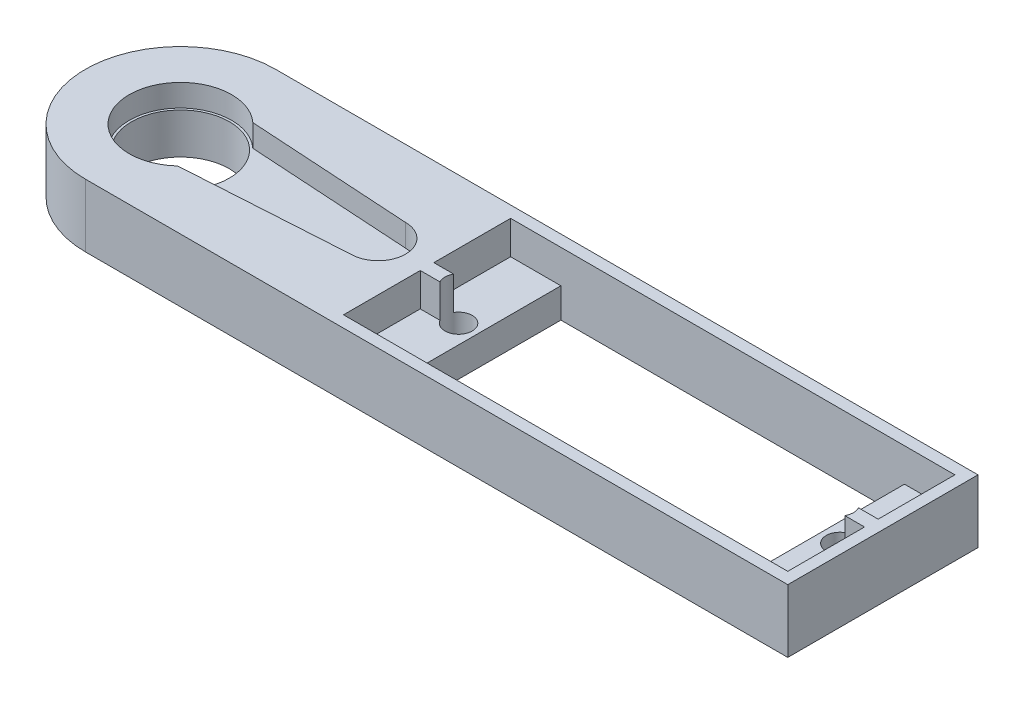
ISO-10303-21;
HEADER;
FILE_DESCRIPTION(('STEP AP214'),'2;1');
FILE_NAME('part.step','',(''),(''),'','','');
FILE_SCHEMA(('AUTOMOTIVE_DESIGN { 1 0 10303 214 1 1 1 1 }'));
ENDSEC;
DATA;
#1=APPLICATION_CONTEXT('core data for automotive mechanical design processes');
#2=APPLICATION_PROTOCOL_DEFINITION('international standard','automotive_design',2000,#1);
#3=PRODUCT_CONTEXT('',#1,'mechanical');
#4=PRODUCT('Part','Part','',(#3));
#5=PRODUCT_RELATED_PRODUCT_CATEGORY('part','',(#4));
#6=PRODUCT_DEFINITION_FORMATION('','',#4);
#7=PRODUCT_DEFINITION_CONTEXT('part definition',#1,'design');
#8=PRODUCT_DEFINITION('design','',#6,#7);
#9=PRODUCT_DEFINITION_SHAPE('','',#8);
#10=(LENGTH_UNIT() NAMED_UNIT(*) SI_UNIT(.MILLI.,.METRE.));
#11=(NAMED_UNIT(*) PLANE_ANGLE_UNIT() SI_UNIT($,.RADIAN.));
#12=(NAMED_UNIT(*) SI_UNIT($,.STERADIAN.) SOLID_ANGLE_UNIT());
#13=UNCERTAINTY_MEASURE_WITH_UNIT(LENGTH_MEASURE(1.E-05),#10,'distance_accuracy_value','');
#14=(GEOMETRIC_REPRESENTATION_CONTEXT(3) GLOBAL_UNCERTAINTY_ASSIGNED_CONTEXT((#13)) GLOBAL_UNIT_ASSIGNED_CONTEXT((#10,
#11,#12)) REPRESENTATION_CONTEXT('',''));
#15=CARTESIAN_POINT('',(0.,0.,0.));
#16=DIRECTION('',(0.,0.,1.));
#17=DIRECTION('',(1.,0.,0.));
#18=AXIS2_PLACEMENT_3D('',#15,#16,#17);
#19=CARTESIAN_POINT('',(33.15,-0.00100000000000013,-7.));
#20=DIRECTION('',(-1.,0.,0.));
#21=DIRECTION('',(0.,0.,1.));
#22=AXIS2_PLACEMENT_3D('',#19,#20,#21);
#23=PLANE('',#22);
#24=DIRECTION('',(0.,1.,0.));
#25=VECTOR('',#24,1.);
#26=CARTESIAN_POINT('',(33.15,-4.15931969640728,-0.5));
#27=LINE('',#26,#25);
#28=CARTESIAN_POINT('',(33.15,2.19,-0.5));
#29=VERTEX_POINT('',#28);
#30=CARTESIAN_POINT('',(33.15,4.64,-0.500000000000001));
#31=VERTEX_POINT('',#30);
#32=EDGE_CURVE('E479',#29,#31,#27,.T.);
#33=ORIENTED_EDGE('',*,*,#32,.F.);
#34=DIRECTION('',(0.,0.,1.));
#35=VECTOR('',#34,1.);
#36=CARTESIAN_POINT('',(33.15,2.19,-6.15));
#37=LINE('',#36,#35);
#38=CARTESIAN_POINT('',(33.15,2.19,-6.15));
#39=VERTEX_POINT('',#38);
#40=EDGE_CURVE('E502',#39,#29,#37,.T.);
#41=ORIENTED_EDGE('',*,*,#40,.F.);
#42=DIRECTION('',(0.,1.,0.));
#43=VECTOR('',#42,1.);
#44=CARTESIAN_POINT('',(33.15,-4.15931969640728,-6.15));
#45=LINE('',#44,#43);
#46=CARTESIAN_POINT('',(33.15,4.64,-6.15));
#47=VERTEX_POINT('',#46);
#48=EDGE_CURVE('E227',#39,#47,#45,.T.);
#49=ORIENTED_EDGE('',*,*,#48,.T.);
#50=DIRECTION('',(0.,0.,1.));
#51=VECTOR('',#50,1.);
#52=CARTESIAN_POINT('',(33.15,4.64,-7.));
#53=LINE('',#52,#51);
#54=EDGE_CURVE('E11',#47,#31,#53,.T.);
#55=ORIENTED_EDGE('',*,*,#54,.T.);
#56=EDGE_LOOP('',(#33,#41,#49,#55));
#57=FACE_BOUND('',#56,.T.);
#58=ADVANCED_FACE('F41',(#57),#23,.F.);
#59=DIRECTION('',(0.,1.,0.));
#60=VECTOR('',#59,1.);
#61=CARTESIAN_POINT('',(33.15,-4.15931969640728,6.15));
#62=LINE('',#61,#60);
#63=CARTESIAN_POINT('',(33.15,2.19,6.15));
#64=VERTEX_POINT('',#63);
#65=CARTESIAN_POINT('',(33.15,4.64,6.15));
#66=VERTEX_POINT('',#65);
#67=EDGE_CURVE('E219',#64,#66,#62,.T.);
#68=ORIENTED_EDGE('',*,*,#67,.F.);
#69=DIRECTION('',(0.,0.,1.));
#70=VECTOR('',#69,1.);
#71=CARTESIAN_POINT('',(33.15,2.19,0.5));
#72=LINE('',#71,#70);
#73=CARTESIAN_POINT('',(33.15,2.19,0.5));
#74=VERTEX_POINT('',#73);
#75=EDGE_CURVE('E455',#74,#64,#72,.T.);
#76=ORIENTED_EDGE('',*,*,#75,.F.);
#77=DIRECTION('',(0.,1.,0.));
#78=VECTOR('',#77,1.);
#79=CARTESIAN_POINT('',(33.15,-4.15931969640728,0.5));
#80=LINE('',#79,#78);
#81=CARTESIAN_POINT('',(33.15,4.64,0.5));
#82=VERTEX_POINT('',#81);
#83=EDGE_CURVE('E226',#74,#82,#80,.T.);
#84=ORIENTED_EDGE('',*,*,#83,.T.);
#85=EDGE_CURVE('E50',#82,#66,#53,.T.);
#86=ORIENTED_EDGE('',*,*,#85,.T.);
#87=EDGE_LOOP('',(#68,#76,#84,#86));
#88=FACE_BOUND('',#87,.T.);
#89=ADVANCED_FACE('F229',(#88),#23,.F.);
#90=CARTESIAN_POINT('',(15.,4.64,0.));
#91=DIRECTION('',(0.,1.,0.));
#92=DIRECTION('',(0.,0.,1.));
#93=AXIS2_PLACEMENT_3D('',#90,#91,#92);
#94=PLANE('',#93);
#95=DIRECTION('',(0.,0.,-1.));
#96=VECTOR('',#95,1.);
#97=CARTESIAN_POINT('',(66.7,4.64,0.));
#98=LINE('',#97,#96);
#99=CARTESIAN_POINT('',(66.7,4.64,7.));
#100=VERTEX_POINT('',#99);
#101=CARTESIAN_POINT('',(66.7,4.64,-7.));
#102=VERTEX_POINT('',#101);
#103=EDGE_CURVE('E272',#100,#102,#98,.T.);
#104=ORIENTED_EDGE('',*,*,#103,.T.);
#105=DIRECTION('',(-1.,0.,0.));
#106=VECTOR('',#105,1.);
#107=CARTESIAN_POINT('',(70.,4.64,-7.));
#108=LINE('',#107,#106);
#109=CARTESIAN_POINT('',(15.,4.64,-7.));
#110=VERTEX_POINT('',#109);
#111=EDGE_CURVE('E239',#102,#110,#108,.T.);
#112=ORIENTED_EDGE('',*,*,#111,.T.);
#113=CARTESIAN_POINT('',(15.,4.64,0.));
#114=DIRECTION('',(0.,1.,0.));
#115=DIRECTION('',(0.,0.,1.));
#116=AXIS2_PLACEMENT_3D('',#113,#114,#115);
#117=CIRCLE('',#116,7.);
#118=CARTESIAN_POINT('',(15.,4.64,7.));
#119=VERTEX_POINT('',#118);
#120=EDGE_CURVE('E238',#110,#119,#117,.T.);
#121=ORIENTED_EDGE('',*,*,#120,.T.);
#122=DIRECTION('',(1.,0.,0.));
#123=VECTOR('',#122,1.);
#124=CARTESIAN_POINT('',(15.,4.64,7.));
#125=LINE('',#124,#123);
#126=EDGE_CURVE('E236',#119,#100,#125,.T.);
#127=ORIENTED_EDGE('',*,*,#126,.T.);
#128=EDGE_LOOP('',(#104,#112,#121,#127));
#129=FACE_BOUND('',#128,.T.);
#130=ORIENTED_EDGE('',*,*,#54,.F.);
#131=DIRECTION('',(1.,0.,0.));
#132=VECTOR('',#131,1.);
#133=CARTESIAN_POINT('',(37.85,4.64,-6.15));
#134=LINE('',#133,#132);
#135=CARTESIAN_POINT('',(65.85,4.64,-6.15));
#136=VERTEX_POINT('',#135);
#137=EDGE_CURVE('E216',#47,#136,#134,.T.);
#138=ORIENTED_EDGE('',*,*,#137,.T.);
#139=DIRECTION('',(0.,0.,-1.));
#140=VECTOR('',#139,1.);
#141=CARTESIAN_POINT('',(65.85,4.64,-6.15));
#142=LINE('',#141,#140);
#143=CARTESIAN_POINT('',(65.85,4.64,-0.5));
#144=VERTEX_POINT('',#143);
#145=EDGE_CURVE('E468',#144,#136,#142,.T.);
#146=ORIENTED_EDGE('',*,*,#145,.F.);
#147=DIRECTION('',(-1.,0.,0.));
#148=VECTOR('',#147,1.);
#149=CARTESIAN_POINT('',(0.,4.64,-0.499999999999984));
#150=LINE('',#149,#148);
#151=CARTESIAN_POINT('',(64.3943800341658,4.64,-0.5));
#152=VERTEX_POINT('',#151);
#153=EDGE_CURVE('E327',#144,#152,#150,.T.);
#154=ORIENTED_EDGE('',*,*,#153,.T.);
#155=CARTESIAN_POINT('',(63.5283546303813,4.64,0.));
#156=DIRECTION('',(0.,1.,0.));
#157=DIRECTION('',(0.,0.,1.));
#158=AXIS2_PLACEMENT_3D('',#155,#156,#157);
#159=CIRCLE('',#158,1.00000000000001);
#160=CARTESIAN_POINT('',(64.3943800341658,4.64,0.5));
#161=VERTEX_POINT('',#160);
#162=EDGE_CURVE('E339',#161,#152,#159,.T.);
#163=ORIENTED_EDGE('',*,*,#162,.F.);
#164=DIRECTION('',(1.,0.,0.));
#165=VECTOR('',#164,1.);
#166=CARTESIAN_POINT('',(0.,4.64,0.499999999999984));
#167=LINE('',#166,#165);
#168=CARTESIAN_POINT('',(65.85,4.64,0.5));
#169=VERTEX_POINT('',#168);
#170=EDGE_CURVE('E321',#161,#169,#167,.T.);
#171=ORIENTED_EDGE('',*,*,#170,.T.);
#172=DIRECTION('',(0.,0.,-1.));
#173=VECTOR('',#172,1.);
#174=CARTESIAN_POINT('',(65.85,4.64,6.15));
#175=LINE('',#174,#173);
#176=CARTESIAN_POINT('',(65.85,4.64,6.15));
#177=VERTEX_POINT('',#176);
#178=EDGE_CURVE('E212',#177,#169,#175,.T.);
#179=ORIENTED_EDGE('',*,*,#178,.F.);
#180=DIRECTION('',(-1.,0.,0.));
#181=VECTOR('',#180,1.);
#182=CARTESIAN_POINT('',(37.85,4.64,6.15));
#183=LINE('',#182,#181);
#184=EDGE_CURVE('E206',#177,#66,#183,.T.);
#185=ORIENTED_EDGE('',*,*,#184,.T.);
#186=ORIENTED_EDGE('',*,*,#85,.F.);
#187=DIRECTION('',(-1.,0.,0.));
#188=VECTOR('',#187,1.);
#189=CARTESIAN_POINT('',(0.,4.64,0.500000000000009));
#190=LINE('',#189,#188);
#191=CARTESIAN_POINT('',(34.6056199658342,4.64,0.5));
#192=VERTEX_POINT('',#191);
#193=EDGE_CURVE('E58',#192,#82,#190,.T.);
#194=ORIENTED_EDGE('',*,*,#193,.F.);
#195=CARTESIAN_POINT('',(35.4716453696186,4.64,0.));
#196=DIRECTION('',(0.,1.,0.));
#197=DIRECTION('',(0.,0.,1.));
#198=AXIS2_PLACEMENT_3D('',#195,#196,#197);
#199=CIRCLE('',#198,1.00000000000001);
#200=CARTESIAN_POINT('',(34.6056199658342,4.64,-0.5));
#201=VERTEX_POINT('',#200);
#202=EDGE_CURVE('E347',#201,#192,#199,.T.);
#203=ORIENTED_EDGE('',*,*,#202,.F.);
#204=DIRECTION('',(-1.,0.,0.));
#205=VECTOR('',#204,1.);
#206=CARTESIAN_POINT('',(0.,4.64,-0.500000000000008));
#207=LINE('',#206,#205);
#208=EDGE_CURVE('E268',#201,#31,#207,.T.);
#209=ORIENTED_EDGE('',*,*,#208,.T.);
#210=EDGE_LOOP('',(#130,#138,#146,#154,#163,#171,#179,#185,#186,#194,#203,#209));
#211=FACE_BOUND('',#210,.T.);
#212=DIRECTION('',(-0.998071858143405,0.,-0.0620690420593882));
#213=VECTOR('',#212,1.);
#214=CARTESIAN_POINT('',(29.5553968890811,4.64,-2.01999279047927));
#215=LINE('',#214,#213);
#216=CARTESIAN_POINT('',(29.5553968890811,4.64,-2.01999279047927));
#217=VERTEX_POINT('',#216);
#218=CARTESIAN_POINT('',(17.5618184422242,4.64,-2.76586085497446));
#219=VERTEX_POINT('',#218);
#220=EDGE_CURVE('E287',#217,#219,#215,.T.);
#221=ORIENTED_EDGE('',*,*,#220,.F.);
#222=CARTESIAN_POINT('',(29.55,4.64,0.));
#223=DIRECTION('',(0.,1.,0.));
#224=DIRECTION('',(0.,0.,1.));
#225=AXIS2_PLACEMENT_3D('',#222,#223,#224);
#226=CIRCLE('',#225,2.02);
#227=CARTESIAN_POINT('',(29.5553968890812,4.64,2.01999279047927));
#228=VERTEX_POINT('',#227);
#229=EDGE_CURVE('E283',#228,#217,#226,.T.);
#230=ORIENTED_EDGE('',*,*,#229,.F.);
#231=DIRECTION('',(0.998071858143405,0.,-0.0620690420593882));
#232=VECTOR('',#231,1.);
#233=CARTESIAN_POINT('',(17.5618184422242,4.64,2.76586085497446));
#234=LINE('',#233,#232);
#235=CARTESIAN_POINT('',(17.5618184422242,4.64,2.76586085497446));
#236=VERTEX_POINT('',#235);
#237=EDGE_CURVE('E230',#236,#228,#234,.T.);
#238=ORIENTED_EDGE('',*,*,#237,.F.);
#239=CARTESIAN_POINT('',(15.,4.64,0.));
#240=DIRECTION('',(0.,1.,0.));
#241=DIRECTION('',(0.,0.,-1.));
#242=AXIS2_PLACEMENT_3D('',#239,#240,#241);
#243=CIRCLE('',#242,3.77);
#244=EDGE_CURVE('E290',#219,#236,#243,.T.);
#245=ORIENTED_EDGE('',*,*,#244,.F.);
#246=EDGE_LOOP('',(#221,#230,#238,#245));
#247=FACE_BOUND('',#246,.T.);
#248=ADVANCED_FACE('F43',(#129,#211,#247),#94,.T.);
#249=CARTESIAN_POINT('',(15.,3.,7.));
#250=DIRECTION('',(0.,0.,-1.));
#251=DIRECTION('',(-1.,0.,0.));
#252=AXIS2_PLACEMENT_3D('',#249,#250,#251);
#253=PLANE('',#252);
#254=DIRECTION('',(1.,0.,0.));
#255=VECTOR('',#254,1.);
#256=CARTESIAN_POINT('',(15.,0.,7.));
#257=LINE('',#256,#255);
#258=CARTESIAN_POINT('',(15.,0.,7.));
#259=VERTEX_POINT('',#258);
#260=CARTESIAN_POINT('',(66.7,0.,7.));
#261=VERTEX_POINT('',#260);
#262=EDGE_CURVE('E45',#259,#261,#257,.T.);
#263=ORIENTED_EDGE('',*,*,#262,.T.);
#264=DIRECTION('',(0.,1.,0.));
#265=VECTOR('',#264,1.);
#266=CARTESIAN_POINT('',(66.7,-36.2154663092994,7.));
#267=LINE('',#266,#265);
#268=EDGE_CURVE('E258',#261,#100,#267,.T.);
#269=ORIENTED_EDGE('',*,*,#268,.T.);
#270=ORIENTED_EDGE('',*,*,#126,.F.);
#271=DIRECTION('',(0.,-1.,0.));
#272=VECTOR('',#271,1.);
#273=CARTESIAN_POINT('',(15.,3.,7.));
#274=LINE('',#273,#272);
#275=EDGE_CURVE('E234',#119,#259,#274,.T.);
#276=ORIENTED_EDGE('',*,*,#275,.T.);
#277=EDGE_LOOP('',(#263,#269,#270,#276));
#278=FACE_BOUND('',#277,.T.);
#279=ADVANCED_FACE('F256',(#278),#253,.F.);
#280=CARTESIAN_POINT('',(15.,3.,-7.));
#281=DIRECTION('',(0.,0.,1.));
#282=DIRECTION('',(1.,0.,0.));
#283=AXIS2_PLACEMENT_3D('',#280,#281,#282);
#284=PLANE('',#283);
#285=ORIENTED_EDGE('',*,*,#111,.F.);
#286=DIRECTION('',(0.,1.,0.));
#287=VECTOR('',#286,1.);
#288=CARTESIAN_POINT('',(66.7,-36.2154663092994,-7.));
#289=LINE('',#288,#287);
#290=CARTESIAN_POINT('',(66.7,0.,-7.));
#291=VERTEX_POINT('',#290);
#292=EDGE_CURVE('E273',#291,#102,#289,.T.);
#293=ORIENTED_EDGE('',*,*,#292,.F.);
#294=DIRECTION('',(-1.,0.,0.));
#295=VECTOR('',#294,1.);
#296=CARTESIAN_POINT('',(15.,0.,-7.));
#297=LINE('',#296,#295);
#298=CARTESIAN_POINT('',(15.,0.,-7.));
#299=VERTEX_POINT('',#298);
#300=EDGE_CURVE('E241',#291,#299,#297,.T.);
#301=ORIENTED_EDGE('',*,*,#300,.T.);
#302=DIRECTION('',(0.,-1.,0.));
#303=VECTOR('',#302,1.);
#304=CARTESIAN_POINT('',(15.,3.,-7.));
#305=LINE('',#304,#303);
#306=EDGE_CURVE('E315',#110,#299,#305,.T.);
#307=ORIENTED_EDGE('',*,*,#306,.F.);
#308=EDGE_LOOP('',(#285,#293,#301,#307));
#309=FACE_BOUND('',#308,.T.);
#310=ADVANCED_FACE('F319',(#309),#284,.F.);
#311=CARTESIAN_POINT('',(15.,0.,0.));
#312=DIRECTION('',(0.,1.,0.));
#313=DIRECTION('',(0.,0.,1.));
#314=AXIS2_PLACEMENT_3D('',#311,#312,#313);
#315=PLANE('',#314);
#316=CARTESIAN_POINT('',(15.,0.,0.));
#317=DIRECTION('',(0.,-1.,0.));
#318=DIRECTION('',(0.,0.,-1.));
#319=AXIS2_PLACEMENT_3D('',#316,#317,#318);
#320=CIRCLE('',#319,3.6);
#321=CARTESIAN_POINT('',(15.,0.,-3.6));
#322=VERTEX_POINT('',#321);
#323=EDGE_CURVE('E286',#322,#322,#320,.T.);
#324=ORIENTED_EDGE('',*,*,#323,.F.);
#325=EDGE_LOOP('',(#324));
#326=FACE_BOUND('',#325,.T.);
#327=ORIENTED_EDGE('',*,*,#300,.F.);
#328=DIRECTION('',(0.,0.,1.));
#329=VECTOR('',#328,1.);
#330=CARTESIAN_POINT('',(66.7,0.,0.));
#331=LINE('',#330,#329);
#332=EDGE_CURVE('E263',#291,#261,#331,.T.);
#333=ORIENTED_EDGE('',*,*,#332,.T.);
#334=ORIENTED_EDGE('',*,*,#262,.F.);
#335=CARTESIAN_POINT('',(15.,0.,0.));
#336=DIRECTION('',(0.,1.,0.));
#337=DIRECTION('',(0.,0.,1.));
#338=AXIS2_PLACEMENT_3D('',#335,#336,#337);
#339=CIRCLE('',#338,7.);
#340=EDGE_CURVE('E302',#299,#259,#339,.T.);
#341=ORIENTED_EDGE('',*,*,#340,.F.);
#342=EDGE_LOOP('',(#327,#333,#334,#341));
#343=FACE_BOUND('',#342,.T.);
#344=DIRECTION('',(0.,0.,1.));
#345=VECTOR('',#344,1.);
#346=CARTESIAN_POINT('',(62.1396314901945,0.,-6.15));
#347=LINE('',#346,#345);
#348=CARTESIAN_POINT('',(62.1396314901945,0.,-6.15));
#349=VERTEX_POINT('',#348);
#350=CARTESIAN_POINT('',(62.1396314901945,0.,6.15));
#351=VERTEX_POINT('',#350);
#352=EDGE_CURVE('E498',#349,#351,#347,.T.);
#353=ORIENTED_EDGE('',*,*,#352,.F.);
#354=DIRECTION('',(-1.,0.,0.));
#355=VECTOR('',#354,1.);
#356=CARTESIAN_POINT('',(0.,0.,-6.15));
#357=LINE('',#356,#355);
#358=CARTESIAN_POINT('',(36.85,0.,-6.15));
#359=VERTEX_POINT('',#358);
#360=EDGE_CURVE('E348',#349,#359,#357,.T.);
#361=ORIENTED_EDGE('',*,*,#360,.T.);
#362=DIRECTION('',(0.,0.,-1.));
#363=VECTOR('',#362,1.);
#364=CARTESIAN_POINT('',(36.85,0.,6.15));
#365=LINE('',#364,#363);
#366=CARTESIAN_POINT('',(36.85,0.,6.15));
#367=VERTEX_POINT('',#366);
#368=EDGE_CURVE('E466',#367,#359,#365,.T.);
#369=ORIENTED_EDGE('',*,*,#368,.F.);
#370=DIRECTION('',(1.,0.,0.));
#371=VECTOR('',#370,1.);
#372=CARTESIAN_POINT('',(0.,0.,6.15));
#373=LINE('',#372,#371);
#374=EDGE_CURVE('E215',#367,#351,#373,.T.);
#375=ORIENTED_EDGE('',*,*,#374,.T.);
#376=EDGE_LOOP('',(#353,#361,#369,#375));
#377=FACE_BOUND('',#376,.T.);
#378=CARTESIAN_POINT('',(63.5283546303813,0.,0.));
#379=DIRECTION('',(0.,1.,0.));
#380=DIRECTION('',(0.,0.,1.));
#381=AXIS2_PLACEMENT_3D('',#378,#379,#380);
#382=CIRCLE('',#381,1.00000000000001);
#383=CARTESIAN_POINT('',(63.5283546303813,0.,1.00000000000001));
#384=VERTEX_POINT('',#383);
#385=EDGE_CURVE('E334',#384,#384,#382,.F.);
#386=ORIENTED_EDGE('',*,*,#385,.F.);
#387=EDGE_LOOP('',(#386));
#388=FACE_BOUND('',#387,.T.);
#389=CARTESIAN_POINT('',(35.4716453696186,0.,0.));
#390=DIRECTION('',(0.,1.,0.));
#391=DIRECTION('',(0.,0.,1.));
#392=AXIS2_PLACEMENT_3D('',#389,#390,#391);
#393=CIRCLE('',#392,1.00000000000001);
#394=CARTESIAN_POINT('',(35.4716453696186,0.,1.00000000000001));
#395=VERTEX_POINT('',#394);
#396=EDGE_CURVE('E343',#395,#395,#393,.F.);
#397=ORIENTED_EDGE('',*,*,#396,.F.);
#398=EDGE_LOOP('',(#397));
#399=FACE_BOUND('',#398,.T.);
#400=ADVANCED_FACE('F264',(#326,#343,#377,#388,#399),#315,.F.);
#401=CARTESIAN_POINT('',(15.,3.,0.));
#402=DIRECTION('',(0.,1.,0.));
#403=DIRECTION('',(0.,0.,1.));
#404=AXIS2_PLACEMENT_3D('',#401,#402,#403);
#405=PLANE('',#404);
#406=CARTESIAN_POINT('',(15.,3.,0.));
#407=DIRECTION('',(0.,1.,0.));
#408=DIRECTION('',(0.,0.,1.));
#409=AXIS2_PLACEMENT_3D('',#406,#407,#408);
#410=CIRCLE('',#409,3.6);
#411=CARTESIAN_POINT('',(15.,3.,3.6));
#412=VERTEX_POINT('',#411);
#413=EDGE_CURVE('E312',#412,#412,#410,.T.);
#414=ORIENTED_EDGE('',*,*,#413,.F.);
#415=EDGE_LOOP('',(#414));
#416=FACE_BOUND('',#415,.T.);
#417=DIRECTION('',(0.998071858143405,0.,-0.0620690420593882));
#418=VECTOR('',#417,1.);
#419=CARTESIAN_POINT('',(17.5618184422242,3.,2.76586085497446));
#420=LINE('',#419,#418);
#421=CARTESIAN_POINT('',(17.5618184422242,3.,2.76586085497446));
#422=VERTEX_POINT('',#421);
#423=CARTESIAN_POINT('',(29.5553968890812,3.,2.01999279047927));
#424=VERTEX_POINT('',#423);
#425=EDGE_CURVE('E242',#422,#424,#420,.T.);
#426=ORIENTED_EDGE('',*,*,#425,.T.);
#427=CARTESIAN_POINT('',(29.55,3.,0.));
#428=DIRECTION('',(0.,1.,0.));
#429=DIRECTION('',(0.,0.,1.));
#430=AXIS2_PLACEMENT_3D('',#427,#428,#429);
#431=CIRCLE('',#430,2.02);
#432=CARTESIAN_POINT('',(29.5553968890811,3.,-2.01999279047927));
#433=VERTEX_POINT('',#432);
#434=EDGE_CURVE('E248',#424,#433,#431,.T.);
#435=ORIENTED_EDGE('',*,*,#434,.T.);
#436=DIRECTION('',(-0.998071858143405,0.,-0.0620690420593882));
#437=VECTOR('',#436,1.);
#438=CARTESIAN_POINT('',(29.5553968890811,3.,-2.01999279047927));
#439=LINE('',#438,#437);
#440=CARTESIAN_POINT('',(17.5618184422242,3.,-2.76586085497446));
#441=VERTEX_POINT('',#440);
#442=EDGE_CURVE('E297',#433,#441,#439,.T.);
#443=ORIENTED_EDGE('',*,*,#442,.T.);
#444=CARTESIAN_POINT('',(15.,3.,0.));
#445=DIRECTION('',(0.,1.,0.));
#446=DIRECTION('',(0.,0.,-1.));
#447=AXIS2_PLACEMENT_3D('',#444,#445,#446);
#448=CIRCLE('',#447,3.77);
#449=EDGE_CURVE('E300',#441,#422,#448,.T.);
#450=ORIENTED_EDGE('',*,*,#449,.T.);
#451=EDGE_LOOP('',(#426,#435,#443,#450));
#452=FACE_BOUND('',#451,.T.);
#453=ADVANCED_FACE('F355',(#416,#452),#405,.T.);
#454=CARTESIAN_POINT('',(15.,3.,0.));
#455=DIRECTION('',(0.,-1.,0.));
#456=DIRECTION('',(0.,0.,-1.));
#457=AXIS2_PLACEMENT_3D('',#454,#455,#456);
#458=CYLINDRICAL_SURFACE('',#457,7.);
#459=ORIENTED_EDGE('',*,*,#340,.T.);
#460=ORIENTED_EDGE('',*,*,#275,.F.);
#461=ORIENTED_EDGE('',*,*,#120,.F.);
#462=ORIENTED_EDGE('',*,*,#306,.T.);
#463=EDGE_LOOP('',(#459,#460,#461,#462));
#464=FACE_BOUND('',#463,.T.);
#465=ADVANCED_FACE('F318',(#464),#458,.T.);
#466=CARTESIAN_POINT('',(15.,3.95,0.));
#467=DIRECTION('',(0.,-1.,0.));
#468=DIRECTION('',(0.,0.,-1.));
#469=AXIS2_PLACEMENT_3D('',#466,#467,#468);
#470=CYLINDRICAL_SURFACE('',#469,3.6);
#471=ORIENTED_EDGE('',*,*,#413,.T.);
#472=EDGE_LOOP('',(#471));
#473=FACE_BOUND('',#472,.T.);
#474=ORIENTED_EDGE('',*,*,#323,.T.);
#475=EDGE_LOOP('',(#474));
#476=FACE_BOUND('',#475,.T.);
#477=ADVANCED_FACE('F375',(#473,#476),#470,.F.);
#478=CARTESIAN_POINT('',(29.55,4.64,0.));
#479=DIRECTION('',(0.,-1.,0.));
#480=DIRECTION('',(0.,0.,-1.));
#481=AXIS2_PLACEMENT_3D('',#478,#479,#480);
#482=CYLINDRICAL_SURFACE('',#481,2.02);
#483=ORIENTED_EDGE('',*,*,#434,.F.);
#484=DIRECTION('',(0.,-1.,0.));
#485=VECTOR('',#484,1.);
#486=CARTESIAN_POINT('',(29.5553968890812,4.64,2.01999279047927));
#487=LINE('',#486,#485);
#488=EDGE_CURVE('E66',#228,#424,#487,.T.);
#489=ORIENTED_EDGE('',*,*,#488,.F.);
#490=ORIENTED_EDGE('',*,*,#229,.T.);
#491=DIRECTION('',(0.,-1.,0.));
#492=VECTOR('',#491,1.);
#493=CARTESIAN_POINT('',(29.5553968890811,4.64,-2.01999279047927));
#494=LINE('',#493,#492);
#495=EDGE_CURVE('E285',#217,#433,#494,.T.);
#496=ORIENTED_EDGE('',*,*,#495,.T.);
#497=EDGE_LOOP('',(#483,#489,#490,#496));
#498=FACE_BOUND('',#497,.T.);
#499=ADVANCED_FACE('F379',(#498),#482,.F.);
#500=CARTESIAN_POINT('',(29.5553968890811,4.64,-2.01999279047927));
#501=DIRECTION('',(-0.0620690420593882,0.,0.998071858143405));
#502=DIRECTION('',(0.998071858143405,0.,0.0620690420593882));
#503=AXIS2_PLACEMENT_3D('',#500,#501,#502);
#504=PLANE('',#503);
#505=ORIENTED_EDGE('',*,*,#442,.F.);
#506=ORIENTED_EDGE('',*,*,#495,.F.);
#507=ORIENTED_EDGE('',*,*,#220,.T.);
#508=DIRECTION('',(0.,-1.,0.));
#509=VECTOR('',#508,1.);
#510=CARTESIAN_POINT('',(17.5618184422242,4.64,-2.76586085497446));
#511=LINE('',#510,#509);
#512=EDGE_CURVE('E289',#219,#441,#511,.T.);
#513=ORIENTED_EDGE('',*,*,#512,.T.);
#514=EDGE_LOOP('',(#505,#506,#507,#513));
#515=FACE_BOUND('',#514,.T.);
#516=ADVANCED_FACE('F383',(#515),#504,.T.);
#517=CARTESIAN_POINT('',(15.,4.64,0.));
#518=DIRECTION('',(0.,-1.,0.));
#519=DIRECTION('',(0.,0.,-1.));
#520=AXIS2_PLACEMENT_3D('',#517,#518,#519);
#521=CYLINDRICAL_SURFACE('',#520,3.77);
#522=ORIENTED_EDGE('',*,*,#449,.F.);
#523=ORIENTED_EDGE('',*,*,#512,.F.);
#524=ORIENTED_EDGE('',*,*,#244,.T.);
#525=DIRECTION('',(0.,-1.,0.));
#526=VECTOR('',#525,1.);
#527=CARTESIAN_POINT('',(17.5618184422242,4.64,2.76586085497446));
#528=LINE('',#527,#526);
#529=EDGE_CURVE('E293',#236,#422,#528,.T.);
#530=ORIENTED_EDGE('',*,*,#529,.T.);
#531=EDGE_LOOP('',(#522,#523,#524,#530));
#532=FACE_BOUND('',#531,.T.);
#533=ADVANCED_FACE('F387',(#532),#521,.F.);
#534=CARTESIAN_POINT('',(17.5618184422242,4.64,2.76586085497446));
#535=DIRECTION('',(-0.0620690420593882,0.,-0.998071858143405));
#536=DIRECTION('',(-0.998071858143405,0.,0.0620690420593882));
#537=AXIS2_PLACEMENT_3D('',#534,#535,#536);
#538=PLANE('',#537);
#539=ORIENTED_EDGE('',*,*,#425,.F.);
#540=ORIENTED_EDGE('',*,*,#529,.F.);
#541=ORIENTED_EDGE('',*,*,#237,.T.);
#542=ORIENTED_EDGE('',*,*,#488,.T.);
#543=EDGE_LOOP('',(#539,#540,#541,#542));
#544=FACE_BOUND('',#543,.T.);
#545=ADVANCED_FACE('F391',(#544),#538,.T.);
#546=CARTESIAN_POINT('',(0.,-9.69759093081403,0.499999999999984));
#547=DIRECTION('',(0.,0.,1.));
#548=DIRECTION('',(1.,0.,0.));
#549=AXIS2_PLACEMENT_3D('',#546,#547,#548);
#550=PLANE('',#549);
#551=DIRECTION('',(0.,1.,0.));
#552=VECTOR('',#551,1.);
#553=CARTESIAN_POINT('',(64.3943800341658,-9.69759093081403,0.5));
#554=LINE('',#553,#552);
#555=CARTESIAN_POINT('',(64.3943800341658,2.19,0.5));
#556=VERTEX_POINT('',#555);
#557=EDGE_CURVE('E322',#556,#161,#554,.T.);
#558=ORIENTED_EDGE('',*,*,#557,.F.);
#559=DIRECTION('',(-1.,0.,0.));
#560=VECTOR('',#559,1.);
#561=CARTESIAN_POINT('',(65.85,2.19,0.5));
#562=LINE('',#561,#560);
#563=CARTESIAN_POINT('',(65.85,2.19,0.5));
#564=VERTEX_POINT('',#563);
#565=EDGE_CURVE('E526',#564,#556,#562,.T.);
#566=ORIENTED_EDGE('',*,*,#565,.F.);
#567=DIRECTION('',(0.,1.,0.));
#568=VECTOR('',#567,1.);
#569=CARTESIAN_POINT('',(65.85,-4.16595483252629,0.5));
#570=LINE('',#569,#568);
#571=EDGE_CURVE('E477',#564,#169,#570,.T.);
#572=ORIENTED_EDGE('',*,*,#571,.T.);
#573=ORIENTED_EDGE('',*,*,#170,.F.);
#574=EDGE_LOOP('',(#558,#566,#572,#573));
#575=FACE_BOUND('',#574,.T.);
#576=ADVANCED_FACE('F395',(#575),#550,.T.);
#577=CARTESIAN_POINT('',(0.,-9.69759093081403,-0.499999999999984));
#578=DIRECTION('',(0.,0.,-1.));
#579=DIRECTION('',(-1.,0.,0.));
#580=AXIS2_PLACEMENT_3D('',#577,#578,#579);
#581=PLANE('',#580);
#582=DIRECTION('',(0.,1.,0.));
#583=VECTOR('',#582,1.);
#584=CARTESIAN_POINT('',(65.85,-4.16595483252629,-0.5));
#585=LINE('',#584,#583);
#586=CARTESIAN_POINT('',(65.85,2.19,-0.5));
#587=VERTEX_POINT('',#586);
#588=EDGE_CURVE('E483',#587,#144,#585,.T.);
#589=ORIENTED_EDGE('',*,*,#588,.F.);
#590=DIRECTION('',(1.,0.,0.));
#591=VECTOR('',#590,1.);
#592=CARTESIAN_POINT('',(64.3943800341658,2.19,-0.499999999999996));
#593=LINE('',#592,#591);
#594=CARTESIAN_POINT('',(64.3943800341658,2.19,-0.499999999999991));
#595=VERTEX_POINT('',#594);
#596=EDGE_CURVE('E532',#595,#587,#593,.T.);
#597=ORIENTED_EDGE('',*,*,#596,.F.);
#598=DIRECTION('',(0.,1.,0.));
#599=VECTOR('',#598,1.);
#600=CARTESIAN_POINT('',(64.3943800341658,-9.69759093081403,-0.5));
#601=LINE('',#600,#599);
#602=EDGE_CURVE('E332',#595,#152,#601,.T.);
#603=ORIENTED_EDGE('',*,*,#602,.T.);
#604=ORIENTED_EDGE('',*,*,#153,.F.);
#605=EDGE_LOOP('',(#589,#597,#603,#604));
#606=FACE_BOUND('',#605,.T.);
#607=ADVANCED_FACE('F407',(#606),#581,.T.);
#608=CARTESIAN_POINT('',(66.7,-36.2154663092994,0.));
#609=DIRECTION('',(1.,0.,0.));
#610=DIRECTION('',(0.,0.,-1.));
#611=AXIS2_PLACEMENT_3D('',#608,#609,#610);
#612=PLANE('',#611);
#613=ORIENTED_EDGE('',*,*,#332,.F.);
#614=ORIENTED_EDGE('',*,*,#292,.T.);
#615=ORIENTED_EDGE('',*,*,#103,.F.);
#616=ORIENTED_EDGE('',*,*,#268,.F.);
#617=EDGE_LOOP('',(#613,#614,#615,#616));
#618=FACE_BOUND('',#617,.T.);
#619=ADVANCED_FACE('F270',(#618),#612,.T.);
#620=CARTESIAN_POINT('',(63.5283546303813,-2.82842712474623,0.));
#621=DIRECTION('',(0.,1.,0.));
#622=DIRECTION('',(0.,0.,1.));
#623=AXIS2_PLACEMENT_3D('',#620,#621,#622);
#624=CYLINDRICAL_SURFACE('',#623,1.00000000000001);
#625=ORIENTED_EDGE('',*,*,#602,.F.);
#626=CARTESIAN_POINT('',(63.5283546303813,2.19,0.));
#627=DIRECTION('',(0.,-1.,0.));
#628=DIRECTION('',(0.,0.,1.));
#629=AXIS2_PLACEMENT_3D('',#626,#627,#628);
#630=CIRCLE('',#629,1.00000000000001);
#631=EDGE_CURVE('E529',#556,#595,#630,.T.);
#632=ORIENTED_EDGE('',*,*,#631,.F.);
#633=ORIENTED_EDGE('',*,*,#557,.T.);
#634=ORIENTED_EDGE('',*,*,#162,.T.);
#635=EDGE_LOOP('',(#625,#632,#633,#634));
#636=FACE_BOUND('',#635,.T.);
#637=ORIENTED_EDGE('',*,*,#385,.T.);
#638=EDGE_LOOP('',(#637));
#639=FACE_BOUND('',#638,.T.);
#640=ADVANCED_FACE('F406',(#636,#639),#624,.F.);
#641=CARTESIAN_POINT('',(65.85,-4.16595483252629,-6.15));
#642=DIRECTION('',(1.,0.,0.));
#643=DIRECTION('',(0.,0.,-1.));
#644=AXIS2_PLACEMENT_3D('',#641,#642,#643);
#645=PLANE('',#644);
#646=ORIENTED_EDGE('',*,*,#588,.T.);
#647=ORIENTED_EDGE('',*,*,#145,.T.);
#648=DIRECTION('',(0.,1.,0.));
#649=VECTOR('',#648,1.);
#650=CARTESIAN_POINT('',(65.85,-4.16595483252629,-6.15));
#651=LINE('',#650,#649);
#652=CARTESIAN_POINT('',(65.85,2.19,-6.15));
#653=VERTEX_POINT('',#652);
#654=EDGE_CURVE('E476',#653,#136,#651,.T.);
#655=ORIENTED_EDGE('',*,*,#654,.F.);
#656=DIRECTION('',(0.,0.,-1.));
#657=VECTOR('',#656,1.);
#658=CARTESIAN_POINT('',(65.85,2.19,-0.5));
#659=LINE('',#658,#657);
#660=EDGE_CURVE('E535',#587,#653,#659,.T.);
#661=ORIENTED_EDGE('',*,*,#660,.F.);
#662=EDGE_LOOP('',(#646,#647,#655,#661));
#663=FACE_BOUND('',#662,.T.);
#664=ADVANCED_FACE('F420',(#663),#645,.F.);
#665=CARTESIAN_POINT('',(62.1396314901945,0.,0.));
#666=DIRECTION('',(-1.,0.,0.));
#667=DIRECTION('',(0.,0.,1.));
#668=AXIS2_PLACEMENT_3D('',#665,#666,#667);
#669=PLANE('',#668);
#670=DIRECTION('',(0.,1.,0.));
#671=VECTOR('',#670,1.);
#672=CARTESIAN_POINT('',(62.1396314901945,0.,6.15));
#673=LINE('',#672,#671);
#674=CARTESIAN_POINT('',(62.1396314901945,2.19,6.15));
#675=VERTEX_POINT('',#674);
#676=EDGE_CURVE('E539',#351,#675,#673,.T.);
#677=ORIENTED_EDGE('',*,*,#676,.T.);
#678=DIRECTION('',(0.,0.,1.));
#679=VECTOR('',#678,1.);
#680=CARTESIAN_POINT('',(62.1396314901945,2.19,-6.15));
#681=LINE('',#680,#679);
#682=CARTESIAN_POINT('',(62.1396314901945,2.19,-6.15));
#683=VERTEX_POINT('',#682);
#684=EDGE_CURVE('E517',#683,#675,#681,.T.);
#685=ORIENTED_EDGE('',*,*,#684,.F.);
#686=DIRECTION('',(0.,-1.,0.));
#687=VECTOR('',#686,1.);
#688=CARTESIAN_POINT('',(62.1396314901945,3.19,-6.15));
#689=LINE('',#688,#687);
#690=EDGE_CURVE('E470',#683,#349,#689,.T.);
#691=ORIENTED_EDGE('',*,*,#690,.T.);
#692=ORIENTED_EDGE('',*,*,#352,.T.);
#693=EDGE_LOOP('',(#677,#685,#691,#692));
#694=FACE_BOUND('',#693,.T.);
#695=ADVANCED_FACE('F430',(#694),#669,.T.);
#696=CARTESIAN_POINT('',(63.5283546303813,2.19,0.));
#697=DIRECTION('',(0.,1.,0.));
#698=DIRECTION('',(0.,0.,1.));
#699=AXIS2_PLACEMENT_3D('',#696,#697,#698);
#700=PLANE('',#699);
#701=DIRECTION('',(-1.,0.,0.));
#702=VECTOR('',#701,1.);
#703=CARTESIAN_POINT('',(65.85,2.19,-6.15));
#704=LINE('',#703,#702);
#705=EDGE_CURVE('E515',#653,#683,#704,.T.);
#706=ORIENTED_EDGE('',*,*,#705,.T.);
#707=ORIENTED_EDGE('',*,*,#684,.T.);
#708=DIRECTION('',(1.,0.,0.));
#709=VECTOR('',#708,1.);
#710=CARTESIAN_POINT('',(62.1396314901945,2.19,6.15));
#711=LINE('',#710,#709);
#712=CARTESIAN_POINT('',(65.85,2.19,6.15));
#713=VERTEX_POINT('',#712);
#714=EDGE_CURVE('E520',#675,#713,#711,.T.);
#715=ORIENTED_EDGE('',*,*,#714,.T.);
#716=DIRECTION('',(0.,0.,-1.));
#717=VECTOR('',#716,1.);
#718=CARTESIAN_POINT('',(65.85,2.19,6.15));
#719=LINE('',#718,#717);
#720=EDGE_CURVE('E523',#713,#564,#719,.T.);
#721=ORIENTED_EDGE('',*,*,#720,.T.);
#722=ORIENTED_EDGE('',*,*,#565,.T.);
#723=ORIENTED_EDGE('',*,*,#631,.T.);
#724=ORIENTED_EDGE('',*,*,#596,.T.);
#725=ORIENTED_EDGE('',*,*,#660,.T.);
#726=EDGE_LOOP('',(#706,#707,#715,#721,#722,#723,#724,#725));
#727=FACE_BOUND('',#726,.T.);
#728=ADVANCED_FACE('F434',(#727),#700,.T.);
#729=CARTESIAN_POINT('',(65.85,-4.16595483252629,6.15));
#730=DIRECTION('',(1.,0.,0.));
#731=DIRECTION('',(0.,0.,-1.));
#732=AXIS2_PLACEMENT_3D('',#729,#730,#731);
#733=PLANE('',#732);
#734=DIRECTION('',(0.,1.,0.));
#735=VECTOR('',#734,1.);
#736=CARTESIAN_POINT('',(65.85,-4.16595483252629,6.15));
#737=LINE('',#736,#735);
#738=EDGE_CURVE('E475',#713,#177,#737,.T.);
#739=ORIENTED_EDGE('',*,*,#738,.T.);
#740=ORIENTED_EDGE('',*,*,#178,.T.);
#741=ORIENTED_EDGE('',*,*,#571,.F.);
#742=ORIENTED_EDGE('',*,*,#720,.F.);
#743=EDGE_LOOP('',(#739,#740,#741,#742));
#744=FACE_BOUND('',#743,.T.);
#745=ADVANCED_FACE('F416',(#744),#733,.F.);
#746=CARTESIAN_POINT('',(35.4716453696186,-2.82842712474623,0.));
#747=DIRECTION('',(0.,1.,0.));
#748=DIRECTION('',(0.,0.,1.));
#749=AXIS2_PLACEMENT_3D('',#746,#747,#748);
#750=CYLINDRICAL_SURFACE('',#749,1.00000000000001);
#751=DIRECTION('',(0.,-1.,0.));
#752=VECTOR('',#751,1.);
#753=CARTESIAN_POINT('',(34.6056199658342,5.59,0.5));
#754=LINE('',#753,#752);
#755=CARTESIAN_POINT('',(34.6056199658342,2.19,0.5));
#756=VERTEX_POINT('',#755);
#757=EDGE_CURVE('E240',#192,#756,#754,.T.);
#758=ORIENTED_EDGE('',*,*,#757,.T.);
#759=CARTESIAN_POINT('',(35.4716453696186,2.19,0.));
#760=DIRECTION('',(0.,-1.,0.));
#761=DIRECTION('',(0.,0.,1.));
#762=AXIS2_PLACEMENT_3D('',#759,#760,#761);
#763=CIRCLE('',#762,1.);
#764=CARTESIAN_POINT('',(34.6056199658342,2.19,-0.500000000000001));
#765=VERTEX_POINT('',#764);
#766=EDGE_CURVE('E509',#765,#756,#763,.T.);
#767=ORIENTED_EDGE('',*,*,#766,.F.);
#768=DIRECTION('',(0.,-1.,0.));
#769=VECTOR('',#768,1.);
#770=CARTESIAN_POINT('',(34.6056199658342,5.59,-0.5));
#771=LINE('',#770,#769);
#772=EDGE_CURVE('E279',#201,#765,#771,.T.);
#773=ORIENTED_EDGE('',*,*,#772,.F.);
#774=ORIENTED_EDGE('',*,*,#202,.T.);
#775=EDGE_LOOP('',(#758,#767,#773,#774));
#776=FACE_BOUND('',#775,.T.);
#777=ORIENTED_EDGE('',*,*,#396,.T.);
#778=EDGE_LOOP('',(#777));
#779=FACE_BOUND('',#778,.T.);
#780=ADVANCED_FACE('F352',(#776,#779),#750,.F.);
#781=CARTESIAN_POINT('',(36.85,0.,0.));
#782=DIRECTION('',(1.,0.,0.));
#783=DIRECTION('',(0.,0.,-1.));
#784=AXIS2_PLACEMENT_3D('',#781,#782,#783);
#785=PLANE('',#784);
#786=DIRECTION('',(0.,1.,0.));
#787=VECTOR('',#786,1.);
#788=CARTESIAN_POINT('',(36.85,0.,-6.15));
#789=LINE('',#788,#787);
#790=CARTESIAN_POINT('',(36.85,2.19,-6.15));
#791=VERTEX_POINT('',#790);
#792=EDGE_CURVE('E461',#359,#791,#789,.T.);
#793=ORIENTED_EDGE('',*,*,#792,.T.);
#794=DIRECTION('',(0.,0.,-1.));
#795=VECTOR('',#794,1.);
#796=CARTESIAN_POINT('',(36.85,2.19,6.15));
#797=LINE('',#796,#795);
#798=CARTESIAN_POINT('',(36.85,2.19,6.15));
#799=VERTEX_POINT('',#798);
#800=EDGE_CURVE('E452',#799,#791,#797,.T.);
#801=ORIENTED_EDGE('',*,*,#800,.F.);
#802=DIRECTION('',(0.,-1.,0.));
#803=VECTOR('',#802,1.);
#804=CARTESIAN_POINT('',(36.85,3.19,6.15));
#805=LINE('',#804,#803);
#806=EDGE_CURVE('E458',#799,#367,#805,.T.);
#807=ORIENTED_EDGE('',*,*,#806,.T.);
#808=ORIENTED_EDGE('',*,*,#368,.T.);
#809=EDGE_LOOP('',(#793,#801,#807,#808));
#810=FACE_BOUND('',#809,.T.);
#811=ADVANCED_FACE('F415',(#810),#785,.T.);
#812=CARTESIAN_POINT('',(35.4716453696186,2.19,0.));
#813=DIRECTION('',(0.,1.,0.));
#814=DIRECTION('',(0.,0.,1.));
#815=AXIS2_PLACEMENT_3D('',#812,#813,#814);
#816=PLANE('',#815);
#817=DIRECTION('',(1.,0.,0.));
#818=VECTOR('',#817,1.);
#819=CARTESIAN_POINT('',(33.15,2.19,6.15));
#820=LINE('',#819,#818);
#821=EDGE_CURVE('E222',#64,#799,#820,.T.);
#822=ORIENTED_EDGE('',*,*,#821,.T.);
#823=ORIENTED_EDGE('',*,*,#800,.T.);
#824=DIRECTION('',(-1.,0.,0.));
#825=VECTOR('',#824,1.);
#826=CARTESIAN_POINT('',(36.85,2.19,-6.15));
#827=LINE('',#826,#825);
#828=EDGE_CURVE('E462',#791,#39,#827,.T.);
#829=ORIENTED_EDGE('',*,*,#828,.T.);
#830=ORIENTED_EDGE('',*,*,#40,.T.);
#831=DIRECTION('',(1.,0.,0.));
#832=VECTOR('',#831,1.);
#833=CARTESIAN_POINT('',(33.15,2.19,-0.5));
#834=LINE('',#833,#832);
#835=EDGE_CURVE('E504',#29,#765,#834,.T.);
#836=ORIENTED_EDGE('',*,*,#835,.T.);
#837=ORIENTED_EDGE('',*,*,#766,.T.);
#838=DIRECTION('',(-1.,0.,0.));
#839=VECTOR('',#838,1.);
#840=CARTESIAN_POINT('',(34.6056199658342,2.19,0.5));
#841=LINE('',#840,#839);
#842=EDGE_CURVE('E512',#756,#74,#841,.T.);
#843=ORIENTED_EDGE('',*,*,#842,.T.);
#844=ORIENTED_EDGE('',*,*,#75,.T.);
#845=EDGE_LOOP('',(#822,#823,#829,#830,#836,#837,#843,#844));
#846=FACE_BOUND('',#845,.T.);
#847=ADVANCED_FACE('F427',(#846),#816,.T.);
#848=CARTESIAN_POINT('',(37.85,4.64,6.15));
#849=DIRECTION('',(0.,0.,1.));
#850=DIRECTION('',(1.,0.,0.));
#851=AXIS2_PLACEMENT_3D('',#848,#849,#850);
#852=PLANE('',#851);
#853=ORIENTED_EDGE('',*,*,#821,.F.);
#854=ORIENTED_EDGE('',*,*,#67,.T.);
#855=ORIENTED_EDGE('',*,*,#184,.F.);
#856=ORIENTED_EDGE('',*,*,#738,.F.);
#857=ORIENTED_EDGE('',*,*,#714,.F.);
#858=ORIENTED_EDGE('',*,*,#676,.F.);
#859=ORIENTED_EDGE('',*,*,#374,.F.);
#860=ORIENTED_EDGE('',*,*,#806,.F.);
#861=EDGE_LOOP('',(#853,#854,#855,#856,#857,#858,#859,#860));
#862=FACE_BOUND('',#861,.T.);
#863=ADVANCED_FACE('F220',(#862),#852,.F.);
#864=CARTESIAN_POINT('',(37.85,4.64,-6.15));
#865=DIRECTION('',(0.,0.,-1.));
#866=DIRECTION('',(-1.,0.,0.));
#867=AXIS2_PLACEMENT_3D('',#864,#865,#866);
#868=PLANE('',#867);
#869=ORIENTED_EDGE('',*,*,#360,.F.);
#870=ORIENTED_EDGE('',*,*,#690,.F.);
#871=ORIENTED_EDGE('',*,*,#705,.F.);
#872=ORIENTED_EDGE('',*,*,#654,.T.);
#873=ORIENTED_EDGE('',*,*,#137,.F.);
#874=ORIENTED_EDGE('',*,*,#48,.F.);
#875=ORIENTED_EDGE('',*,*,#828,.F.);
#876=ORIENTED_EDGE('',*,*,#792,.F.);
#877=EDGE_LOOP('',(#869,#870,#871,#872,#873,#874,#875,#876));
#878=FACE_BOUND('',#877,.T.);
#879=ADVANCED_FACE('F400',(#878),#868,.F.);
#880=CARTESIAN_POINT('',(49.5,5.59,0.499999999999996));
#881=DIRECTION('',(0.,0.,-1.));
#882=DIRECTION('',(1.,0.,0.));
#883=AXIS2_PLACEMENT_3D('',#880,#881,#882);
#884=PLANE('',#883);
#885=ORIENTED_EDGE('',*,*,#193,.T.);
#886=ORIENTED_EDGE('',*,*,#83,.F.);
#887=ORIENTED_EDGE('',*,*,#842,.F.);
#888=ORIENTED_EDGE('',*,*,#757,.F.);
#889=EDGE_LOOP('',(#885,#886,#887,#888));
#890=FACE_BOUND('',#889,.T.);
#891=ADVANCED_FACE('F396',(#890),#884,.F.);
#892=CARTESIAN_POINT('',(49.5,5.59,-0.499999999999996));
#893=DIRECTION('',(0.,0.,-1.));
#894=DIRECTION('',(1.,0.,0.));
#895=AXIS2_PLACEMENT_3D('',#892,#893,#894);
#896=PLANE('',#895);
#897=ORIENTED_EDGE('',*,*,#772,.T.);
#898=ORIENTED_EDGE('',*,*,#835,.F.);
#899=ORIENTED_EDGE('',*,*,#32,.T.);
#900=ORIENTED_EDGE('',*,*,#208,.F.);
#901=EDGE_LOOP('',(#897,#898,#899,#900));
#902=FACE_BOUND('',#901,.T.);
#903=ADVANCED_FACE('F399',(#902),#896,.T.);
#904=CLOSED_SHELL('',(#58,#89,#248,#279,#310,#400,#453,#465,#477,#499,#516,#533,#545,#576,#607,
#619,#640,#664,#695,#728,#745,#780,#811,#847,#863,#879,#891,#903));
#905=MANIFOLD_SOLID_BREP('B2',#904);
#906=ADVANCED_BREP_SHAPE_REPRESENTATION('',(#18,#905),#14);
#907=SHAPE_DEFINITION_REPRESENTATION(#9,#906);
ENDSEC;
END-ISO-10303-21;
